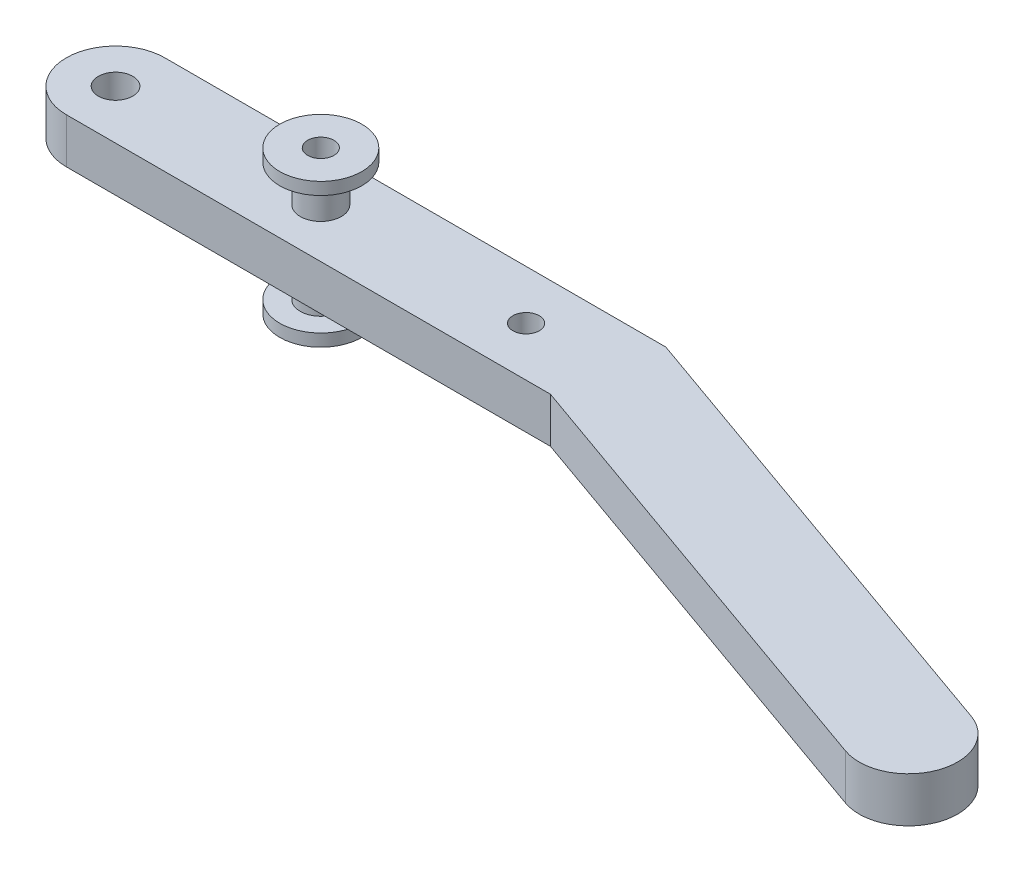
ISO-10303-21;
HEADER;
FILE_DESCRIPTION(('STEP AP214'),'2;1');
FILE_NAME('part.step','',(''),(''),'','','');
FILE_SCHEMA(('AUTOMOTIVE_DESIGN { 1 0 10303 214 1 1 1 1 }'));
ENDSEC;
DATA;
#1=APPLICATION_CONTEXT('core data for automotive mechanical design processes');
#2=APPLICATION_PROTOCOL_DEFINITION('international standard','automotive_design',2000,#1);
#3=PRODUCT_CONTEXT('',#1,'mechanical');
#4=PRODUCT('Part','Part','',(#3));
#5=PRODUCT_RELATED_PRODUCT_CATEGORY('part','',(#4));
#6=PRODUCT_DEFINITION_FORMATION('','',#4);
#7=PRODUCT_DEFINITION_CONTEXT('part definition',#1,'design');
#8=PRODUCT_DEFINITION('design','',#6,#7);
#9=PRODUCT_DEFINITION_SHAPE('','',#8);
#10=(LENGTH_UNIT() NAMED_UNIT(*) SI_UNIT(.MILLI.,.METRE.));
#11=(NAMED_UNIT(*) PLANE_ANGLE_UNIT() SI_UNIT($,.RADIAN.));
#12=(NAMED_UNIT(*) SI_UNIT($,.STERADIAN.) SOLID_ANGLE_UNIT());
#13=UNCERTAINTY_MEASURE_WITH_UNIT(LENGTH_MEASURE(1.E-05),#10,'distance_accuracy_value','');
#14=(GEOMETRIC_REPRESENTATION_CONTEXT(3) GLOBAL_UNCERTAINTY_ASSIGNED_CONTEXT((#13)) GLOBAL_UNIT_ASSIGNED_CONTEXT((#10,
#11,#12)) REPRESENTATION_CONTEXT('',''));
#15=CARTESIAN_POINT('',(0.,0.,0.));
#16=DIRECTION('',(0.,0.,1.));
#17=DIRECTION('',(1.,0.,0.));
#18=AXIS2_PLACEMENT_3D('',#15,#16,#17);
#19=CARTESIAN_POINT('',(25.,0.,0.));
#20=DIRECTION('',(0.,-1.,0.));
#21=DIRECTION('',(0.,0.,1.));
#22=AXIS2_PLACEMENT_3D('',#19,#20,#21);
#23=PLANE('',#22);
#24=CARTESIAN_POINT('',(25.,0.,0.));
#25=DIRECTION('',(0.,1.,0.));
#26=DIRECTION('',(0.,0.,1.));
#27=AXIS2_PLACEMENT_3D('',#24,#25,#26);
#28=CIRCLE('',#27,2.5);
#29=CARTESIAN_POINT('',(25.,0.,2.5));
#30=VERTEX_POINT('',#29);
#31=EDGE_CURVE('E47',#30,#30,#28,.T.);
#32=ORIENTED_EDGE('',*,*,#31,.T.);
#33=EDGE_LOOP('',(#32));
#34=FACE_BOUND('',#33,.T.);
#35=CARTESIAN_POINT('',(25.,0.,0.));
#36=DIRECTION('',(0.,1.,0.));
#37=DIRECTION('',(0.,0.,1.));
#38=AXIS2_PLACEMENT_3D('',#35,#36,#37);
#39=CIRCLE('',#38,1.6);
#40=CARTESIAN_POINT('',(25.,0.,1.6));
#41=VERTEX_POINT('',#40);
#42=EDGE_CURVE('E54',#41,#41,#39,.T.);
#43=ORIENTED_EDGE('',*,*,#42,.F.);
#44=EDGE_LOOP('',(#43));
#45=FACE_BOUND('',#44,.T.);
#46=ADVANCED_FACE('F43',(#34,#45),#23,.F.);
#47=CARTESIAN_POINT('',(25.,-4.5,0.));
#48=DIRECTION('',(0.,1.,0.));
#49=DIRECTION('',(0.,0.,-1.));
#50=AXIS2_PLACEMENT_3D('',#47,#48,#49);
#51=CYLINDRICAL_SURFACE('',#50,2.5);
#52=CARTESIAN_POINT('',(25.,-4.5,0.));
#53=DIRECTION('',(0.,1.,0.));
#54=DIRECTION('',(0.,0.,1.));
#55=AXIS2_PLACEMENT_3D('',#52,#53,#54);
#56=CIRCLE('',#55,2.5);
#57=CARTESIAN_POINT('',(25.,-4.5,2.5));
#58=VERTEX_POINT('',#57);
#59=EDGE_CURVE('E11',#58,#58,#56,.T.);
#60=ORIENTED_EDGE('',*,*,#59,.T.);
#61=EDGE_LOOP('',(#60));
#62=FACE_BOUND('',#61,.T.);
#63=ORIENTED_EDGE('',*,*,#31,.F.);
#64=EDGE_LOOP('',(#63));
#65=FACE_BOUND('',#64,.T.);
#66=ADVANCED_FACE('F45',(#62,#65),#51,.T.);
#67=CARTESIAN_POINT('',(25.,-4.5,0.));
#68=DIRECTION('',(0.,1.,0.));
#69=DIRECTION('',(0.,0.,-1.));
#70=AXIS2_PLACEMENT_3D('',#67,#68,#69);
#71=CYLINDRICAL_SURFACE('',#70,1.6);
#72=ORIENTED_EDGE('',*,*,#42,.T.);
#73=EDGE_LOOP('',(#72));
#74=FACE_BOUND('',#73,.T.);
#75=CARTESIAN_POINT('',(25.,-6.,0.));
#76=DIRECTION('',(0.,1.,0.));
#77=DIRECTION('',(0.,0.,1.));
#78=AXIS2_PLACEMENT_3D('',#75,#76,#77);
#79=CIRCLE('',#78,1.6);
#80=CARTESIAN_POINT('',(25.,-6.,1.6));
#81=VERTEX_POINT('',#80);
#82=EDGE_CURVE('E62',#81,#81,#79,.T.);
#83=ORIENTED_EDGE('',*,*,#82,.F.);
#84=EDGE_LOOP('',(#83));
#85=FACE_BOUND('',#84,.T.);
#86=ADVANCED_FACE('F70',(#74,#85),#71,.F.);
#87=CARTESIAN_POINT('',(25.,-6.,0.));
#88=DIRECTION('',(0.,-1.,0.));
#89=DIRECTION('',(0.,0.,1.));
#90=AXIS2_PLACEMENT_3D('',#87,#88,#89);
#91=PLANE('',#90);
#92=CARTESIAN_POINT('',(25.,-6.,0.));
#93=DIRECTION('',(0.,1.,0.));
#94=DIRECTION('',(0.,0.,1.));
#95=AXIS2_PLACEMENT_3D('',#92,#93,#94);
#96=CIRCLE('',#95,5.);
#97=CARTESIAN_POINT('',(25.,-6.,5.));
#98=VERTEX_POINT('',#97);
#99=EDGE_CURVE('E58',#98,#98,#96,.T.);
#100=ORIENTED_EDGE('',*,*,#99,.F.);
#101=EDGE_LOOP('',(#100));
#102=FACE_BOUND('',#101,.T.);
#103=ORIENTED_EDGE('',*,*,#82,.T.);
#104=EDGE_LOOP('',(#103));
#105=FACE_BOUND('',#104,.T.);
#106=ADVANCED_FACE('F68',(#102,#105),#91,.T.);
#107=CARTESIAN_POINT('',(25.,-4.5,0.));
#108=DIRECTION('',(0.,-1.,0.));
#109=DIRECTION('',(0.,0.,1.));
#110=AXIS2_PLACEMENT_3D('',#107,#108,#109);
#111=PLANE('',#110);
#112=ORIENTED_EDGE('',*,*,#59,.F.);
#113=EDGE_LOOP('',(#112));
#114=FACE_BOUND('',#113,.T.);
#115=CARTESIAN_POINT('',(25.,-4.5,0.));
#116=DIRECTION('',(0.,1.,0.));
#117=DIRECTION('',(0.,0.,1.));
#118=AXIS2_PLACEMENT_3D('',#115,#116,#117);
#119=CIRCLE('',#118,5.);
#120=CARTESIAN_POINT('',(25.,-4.5,5.));
#121=VERTEX_POINT('',#120);
#122=EDGE_CURVE('E59',#121,#121,#119,.T.);
#123=ORIENTED_EDGE('',*,*,#122,.T.);
#124=EDGE_LOOP('',(#123));
#125=FACE_BOUND('',#124,.T.);
#126=ADVANCED_FACE('F78',(#114,#125),#111,.F.);
#127=CARTESIAN_POINT('',(25.,-6.,0.));
#128=DIRECTION('',(0.,1.,0.));
#129=DIRECTION('',(0.,0.,-1.));
#130=AXIS2_PLACEMENT_3D('',#127,#128,#129);
#131=CYLINDRICAL_SURFACE('',#130,5.);
#132=ORIENTED_EDGE('',*,*,#99,.T.);
#133=EDGE_LOOP('',(#132));
#134=FACE_BOUND('',#133,.T.);
#135=ORIENTED_EDGE('',*,*,#122,.F.);
#136=EDGE_LOOP('',(#135));
#137=FACE_BOUND('',#136,.T.);
#138=ADVANCED_FACE('F114',(#134,#137),#131,.T.);
#139=CLOSED_SHELL('',(#46,#66,#86,#106,#126,#138));
#140=MANIFOLD_SOLID_BREP('B2',#139);
#141=CARTESIAN_POINT('',(25.,5.5,0.));
#142=DIRECTION('',(0.,1.,0.));
#143=DIRECTION('',(0.,0.,1.));
#144=AXIS2_PLACEMENT_3D('',#141,#142,#143);
#145=PLANE('',#144);
#146=CARTESIAN_POINT('',(25.,5.5,0.));
#147=DIRECTION('',(0.,1.,0.));
#148=DIRECTION('',(0.,0.,1.));
#149=AXIS2_PLACEMENT_3D('',#146,#147,#148);
#150=CIRCLE('',#149,2.5);
#151=CARTESIAN_POINT('',(25.,5.5,2.5));
#152=VERTEX_POINT('',#151);
#153=EDGE_CURVE('E150',#152,#152,#150,.T.);
#154=ORIENTED_EDGE('',*,*,#153,.F.);
#155=EDGE_LOOP('',(#154));
#156=FACE_BOUND('',#155,.T.);
#157=CARTESIAN_POINT('',(25.,5.5,0.));
#158=DIRECTION('',(0.,1.,0.));
#159=DIRECTION('',(0.,0.,1.));
#160=AXIS2_PLACEMENT_3D('',#157,#158,#159);
#161=CIRCLE('',#160,1.6);
#162=CARTESIAN_POINT('',(25.,5.5,1.6));
#163=VERTEX_POINT('',#162);
#164=EDGE_CURVE('E157',#163,#163,#161,.T.);
#165=ORIENTED_EDGE('',*,*,#164,.T.);
#166=EDGE_LOOP('',(#165));
#167=FACE_BOUND('',#166,.T.);
#168=ADVANCED_FACE('F146',(#156,#167),#145,.F.);
#169=CARTESIAN_POINT('',(25.,10.,0.));
#170=DIRECTION('',(0.,-1.,0.));
#171=DIRECTION('',(0.,0.,-1.));
#172=AXIS2_PLACEMENT_3D('',#169,#170,#171);
#173=CYLINDRICAL_SURFACE('',#172,2.5);
#174=CARTESIAN_POINT('',(25.,10.,0.));
#175=DIRECTION('',(0.,1.,0.));
#176=DIRECTION('',(0.,0.,1.));
#177=AXIS2_PLACEMENT_3D('',#174,#175,#176);
#178=CIRCLE('',#177,2.5);
#179=CARTESIAN_POINT('',(25.,10.,2.5));
#180=VERTEX_POINT('',#179);
#181=EDGE_CURVE('E42',#180,#180,#178,.T.);
#182=ORIENTED_EDGE('',*,*,#181,.F.);
#183=EDGE_LOOP('',(#182));
#184=FACE_BOUND('',#183,.T.);
#185=ORIENTED_EDGE('',*,*,#153,.T.);
#186=EDGE_LOOP('',(#185));
#187=FACE_BOUND('',#186,.T.);
#188=ADVANCED_FACE('F148',(#184,#187),#173,.T.);
#189=CARTESIAN_POINT('',(25.,10.,0.));
#190=DIRECTION('',(0.,-1.,0.));
#191=DIRECTION('',(0.,0.,-1.));
#192=AXIS2_PLACEMENT_3D('',#189,#190,#191);
#193=CYLINDRICAL_SURFACE('',#192,1.6);
#194=ORIENTED_EDGE('',*,*,#164,.F.);
#195=EDGE_LOOP('',(#194));
#196=FACE_BOUND('',#195,.T.);
#197=CARTESIAN_POINT('',(25.,11.5,0.));
#198=DIRECTION('',(0.,1.,0.));
#199=DIRECTION('',(0.,0.,1.));
#200=AXIS2_PLACEMENT_3D('',#197,#198,#199);
#201=CIRCLE('',#200,1.6);
#202=CARTESIAN_POINT('',(25.,11.5,1.6));
#203=VERTEX_POINT('',#202);
#204=EDGE_CURVE('E165',#203,#203,#201,.T.);
#205=ORIENTED_EDGE('',*,*,#204,.T.);
#206=EDGE_LOOP('',(#205));
#207=FACE_BOUND('',#206,.T.);
#208=ADVANCED_FACE('F171',(#196,#207),#193,.F.);
#209=CARTESIAN_POINT('',(25.,11.5,0.));
#210=DIRECTION('',(0.,1.,0.));
#211=DIRECTION('',(0.,0.,1.));
#212=AXIS2_PLACEMENT_3D('',#209,#210,#211);
#213=PLANE('',#212);
#214=CARTESIAN_POINT('',(25.,11.5,0.));
#215=DIRECTION('',(0.,1.,0.));
#216=DIRECTION('',(0.,0.,1.));
#217=AXIS2_PLACEMENT_3D('',#214,#215,#216);
#218=CIRCLE('',#217,5.);
#219=CARTESIAN_POINT('',(25.,11.5,5.));
#220=VERTEX_POINT('',#219);
#221=EDGE_CURVE('E161',#220,#220,#218,.T.);
#222=ORIENTED_EDGE('',*,*,#221,.T.);
#223=EDGE_LOOP('',(#222));
#224=FACE_BOUND('',#223,.T.);
#225=ORIENTED_EDGE('',*,*,#204,.F.);
#226=EDGE_LOOP('',(#225));
#227=FACE_BOUND('',#226,.T.);
#228=ADVANCED_FACE('F173',(#224,#227),#213,.T.);
#229=CARTESIAN_POINT('',(25.,10.,0.));
#230=DIRECTION('',(0.,1.,0.));
#231=DIRECTION('',(0.,0.,1.));
#232=AXIS2_PLACEMENT_3D('',#229,#230,#231);
#233=PLANE('',#232);
#234=ORIENTED_EDGE('',*,*,#181,.T.);
#235=EDGE_LOOP('',(#234));
#236=FACE_BOUND('',#235,.T.);
#237=CARTESIAN_POINT('',(25.,10.,0.));
#238=DIRECTION('',(0.,1.,0.));
#239=DIRECTION('',(0.,0.,1.));
#240=AXIS2_PLACEMENT_3D('',#237,#238,#239);
#241=CIRCLE('',#240,5.);
#242=CARTESIAN_POINT('',(25.,10.,5.));
#243=VERTEX_POINT('',#242);
#244=EDGE_CURVE('E162',#243,#243,#241,.T.);
#245=ORIENTED_EDGE('',*,*,#244,.F.);
#246=EDGE_LOOP('',(#245));
#247=FACE_BOUND('',#246,.T.);
#248=ADVANCED_FACE('F175',(#236,#247),#233,.F.);
#249=CARTESIAN_POINT('',(25.,11.5,0.));
#250=DIRECTION('',(0.,-1.,0.));
#251=DIRECTION('',(0.,0.,-1.));
#252=AXIS2_PLACEMENT_3D('',#249,#250,#251);
#253=CYLINDRICAL_SURFACE('',#252,5.);
#254=ORIENTED_EDGE('',*,*,#221,.F.);
#255=EDGE_LOOP('',(#254));
#256=FACE_BOUND('',#255,.T.);
#257=ORIENTED_EDGE('',*,*,#244,.T.);
#258=EDGE_LOOP('',(#257));
#259=FACE_BOUND('',#258,.T.);
#260=ADVANCED_FACE('F182',(#256,#259),#253,.T.);
#261=CLOSED_SHELL('',(#168,#188,#208,#228,#248,#260));
#262=MANIFOLD_SOLID_BREP('B6',#261);
#263=CARTESIAN_POINT('',(0.,5.5,0.));
#264=DIRECTION('',(0.,1.,0.));
#265=DIRECTION('',(0.,0.,1.));
#266=AXIS2_PLACEMENT_3D('',#263,#264,#265);
#267=PLANE('',#266);
#268=CARTESIAN_POINT('',(0.,5.5,0.));
#269=DIRECTION('',(0.,1.,0.));
#270=DIRECTION('',(0.,0.,1.));
#271=AXIS2_PLACEMENT_3D('',#268,#269,#270);
#272=CIRCLE('',#271,2.1);
#273=CARTESIAN_POINT('',(0.,5.5,2.1));
#274=VERTEX_POINT('',#273);
#275=EDGE_CURVE('E391',#274,#274,#272,.T.);
#276=ORIENTED_EDGE('',*,*,#275,.F.);
#277=EDGE_LOOP('',(#276));
#278=FACE_BOUND('',#277,.T.);
#279=CARTESIAN_POINT('',(0.,5.5,0.));
#280=DIRECTION('',(0.,1.,0.));
#281=DIRECTION('',(0.,0.,1.));
#282=AXIS2_PLACEMENT_3D('',#279,#280,#281);
#283=CIRCLE('',#282,6.);
#284=CARTESIAN_POINT('',(0.,5.5,-6.));
#285=VERTEX_POINT('',#284);
#286=CARTESIAN_POINT('',(0.,5.5,6.));
#287=VERTEX_POINT('',#286);
#288=EDGE_CURVE('E336',#285,#287,#283,.T.);
#289=ORIENTED_EDGE('',*,*,#288,.T.);
#290=DIRECTION('',(1.,0.,0.));
#291=VECTOR('',#290,1.);
#292=CARTESIAN_POINT('',(0.,5.5,6.));
#293=LINE('',#292,#291);
#294=CARTESIAN_POINT('',(58.9705627484771,5.5,6.));
#295=VERTEX_POINT('',#294);
#296=EDGE_CURVE('E294',#287,#295,#293,.T.);
#297=ORIENTED_EDGE('',*,*,#296,.T.);
#298=DIRECTION('',(0.942809041582063,0.,0.333333333333333));
#299=VECTOR('',#298,1.);
#300=CARTESIAN_POINT('',(58.9705627484771,5.5,6.));
#301=LINE('',#300,#299);
#302=CARTESIAN_POINT('',(114.568542494924,5.5,25.6568542494924));
#303=VERTEX_POINT('',#302);
#304=EDGE_CURVE('E307',#295,#303,#301,.T.);
#305=ORIENTED_EDGE('',*,*,#304,.T.);
#306=CARTESIAN_POINT('',(116.568542494924,5.5,20.));
#307=DIRECTION('',(0.,1.,0.));
#308=DIRECTION('',(0.,0.,1.));
#309=AXIS2_PLACEMENT_3D('',#306,#307,#308);
#310=CIRCLE('',#309,6.);
#311=CARTESIAN_POINT('',(118.568542494924,5.5,14.3431457505076));
#312=VERTEX_POINT('',#311);
#313=EDGE_CURVE('E301',#303,#312,#310,.T.);
#314=ORIENTED_EDGE('',*,*,#313,.T.);
#315=DIRECTION('',(-0.942809041582063,0.,-0.333333333333333));
#316=VECTOR('',#315,1.);
#317=CARTESIAN_POINT('',(61.0294372515229,5.5,-6.));
#318=LINE('',#317,#316);
#319=CARTESIAN_POINT('',(61.0294372515229,5.5,-6.));
#320=VERTEX_POINT('',#319);
#321=EDGE_CURVE('E305',#312,#320,#318,.T.);
#322=ORIENTED_EDGE('',*,*,#321,.T.);
#323=DIRECTION('',(-1.,0.,0.));
#324=VECTOR('',#323,1.);
#325=CARTESIAN_POINT('',(0.,5.5,-6.));
#326=LINE('',#325,#324);
#327=EDGE_CURVE('E257',#320,#285,#326,.T.);
#328=ORIENTED_EDGE('',*,*,#327,.T.);
#329=EDGE_LOOP('',(#289,#297,#305,#314,#322,#328));
#330=FACE_BOUND('',#329,.T.);
#331=CARTESIAN_POINT('',(50.,5.5,0.));
#332=DIRECTION('',(0.,1.,0.));
#333=DIRECTION('',(0.,0.,1.));
#334=AXIS2_PLACEMENT_3D('',#331,#332,#333);
#335=CIRCLE('',#334,1.6);
#336=CARTESIAN_POINT('',(50.,5.5,1.6));
#337=VERTEX_POINT('',#336);
#338=EDGE_CURVE('E329',#337,#337,#335,.T.);
#339=ORIENTED_EDGE('',*,*,#338,.F.);
#340=EDGE_LOOP('',(#339));
#341=FACE_BOUND('',#340,.T.);
#342=CARTESIAN_POINT('',(25.,5.5,0.));
#343=DIRECTION('',(0.,1.,0.));
#344=DIRECTION('',(0.,0.,1.));
#345=AXIS2_PLACEMENT_3D('',#342,#343,#344);
#346=CIRCLE('',#345,1.6);
#347=CARTESIAN_POINT('',(25.,5.5,1.6));
#348=VERTEX_POINT('',#347);
#349=EDGE_CURVE('E382',#348,#348,#346,.T.);
#350=ORIENTED_EDGE('',*,*,#349,.F.);
#351=EDGE_LOOP('',(#350));
#352=FACE_BOUND('',#351,.T.);
#353=ADVANCED_FACE('F240',(#278,#330,#341,#352),#267,.T.);
#354=CARTESIAN_POINT('',(0.,0.,0.));
#355=DIRECTION('',(0.,1.,0.));
#356=DIRECTION('',(0.,0.,1.));
#357=AXIS2_PLACEMENT_3D('',#354,#355,#356);
#358=PLANE('',#357);
#359=CARTESIAN_POINT('',(0.,0.,0.));
#360=DIRECTION('',(0.,1.,0.));
#361=DIRECTION('',(0.,0.,1.));
#362=AXIS2_PLACEMENT_3D('',#359,#360,#361);
#363=CIRCLE('',#362,6.);
#364=CARTESIAN_POINT('',(0.,0.,-6.));
#365=VERTEX_POINT('',#364);
#366=CARTESIAN_POINT('',(0.,0.,6.));
#367=VERTEX_POINT('',#366);
#368=EDGE_CURVE('E325',#365,#367,#363,.T.);
#369=ORIENTED_EDGE('',*,*,#368,.F.);
#370=DIRECTION('',(-1.,0.,0.));
#371=VECTOR('',#370,1.);
#372=CARTESIAN_POINT('',(0.,0.,-6.));
#373=LINE('',#372,#371);
#374=CARTESIAN_POINT('',(61.0294372515229,0.,-6.));
#375=VERTEX_POINT('',#374);
#376=EDGE_CURVE('E286',#375,#365,#373,.T.);
#377=ORIENTED_EDGE('',*,*,#376,.F.);
#378=DIRECTION('',(-0.942809041582063,0.,-0.333333333333333));
#379=VECTOR('',#378,1.);
#380=CARTESIAN_POINT('',(61.0294372515229,0.,-6.));
#381=LINE('',#380,#379);
#382=CARTESIAN_POINT('',(118.568542494924,0.,14.3431457505076));
#383=VERTEX_POINT('',#382);
#384=EDGE_CURVE('E280',#383,#375,#381,.T.);
#385=ORIENTED_EDGE('',*,*,#384,.F.);
#386=CARTESIAN_POINT('',(116.568542494924,0.,20.));
#387=DIRECTION('',(0.,1.,0.));
#388=DIRECTION('',(0.,0.,1.));
#389=AXIS2_PLACEMENT_3D('',#386,#387,#388);
#390=CIRCLE('',#389,6.);
#391=CARTESIAN_POINT('',(114.568542494924,0.,25.6568542494924));
#392=VERTEX_POINT('',#391);
#393=EDGE_CURVE('E315',#392,#383,#390,.T.);
#394=ORIENTED_EDGE('',*,*,#393,.F.);
#395=DIRECTION('',(0.942809041582063,0.,0.333333333333333));
#396=VECTOR('',#395,1.);
#397=CARTESIAN_POINT('',(58.9705627484771,0.,6.));
#398=LINE('',#397,#396);
#399=CARTESIAN_POINT('',(58.9705627484771,0.,6.));
#400=VERTEX_POINT('',#399);
#401=EDGE_CURVE('E331',#400,#392,#398,.T.);
#402=ORIENTED_EDGE('',*,*,#401,.F.);
#403=DIRECTION('',(1.,0.,0.));
#404=VECTOR('',#403,1.);
#405=CARTESIAN_POINT('',(0.,0.,6.));
#406=LINE('',#405,#404);
#407=EDGE_CURVE('E328',#367,#400,#406,.T.);
#408=ORIENTED_EDGE('',*,*,#407,.F.);
#409=EDGE_LOOP('',(#369,#377,#385,#394,#402,#408));
#410=FACE_BOUND('',#409,.T.);
#411=CARTESIAN_POINT('',(50.,0.,0.));
#412=DIRECTION('',(0.,1.,0.));
#413=DIRECTION('',(0.,0.,1.));
#414=AXIS2_PLACEMENT_3D('',#411,#412,#413);
#415=CIRCLE('',#414,1.6);
#416=CARTESIAN_POINT('',(50.,0.,1.6));
#417=VERTEX_POINT('',#416);
#418=EDGE_CURVE('E394',#417,#417,#415,.T.);
#419=ORIENTED_EDGE('',*,*,#418,.T.);
#420=EDGE_LOOP('',(#419));
#421=FACE_BOUND('',#420,.T.);
#422=CARTESIAN_POINT('',(0.,0.,0.));
#423=DIRECTION('',(0.,1.,0.));
#424=DIRECTION('',(0.,0.,1.));
#425=AXIS2_PLACEMENT_3D('',#422,#423,#424);
#426=CIRCLE('',#425,2.1);
#427=CARTESIAN_POINT('',(0.,0.,2.1));
#428=VERTEX_POINT('',#427);
#429=EDGE_CURVE('E388',#428,#428,#426,.T.);
#430=ORIENTED_EDGE('',*,*,#429,.T.);
#431=EDGE_LOOP('',(#430));
#432=FACE_BOUND('',#431,.T.);
#433=CARTESIAN_POINT('',(25.,0.,0.));
#434=DIRECTION('',(0.,1.,0.));
#435=DIRECTION('',(0.,0.,1.));
#436=AXIS2_PLACEMENT_3D('',#433,#434,#435);
#437=CIRCLE('',#436,1.6);
#438=CARTESIAN_POINT('',(25.,0.,1.6));
#439=VERTEX_POINT('',#438);
#440=EDGE_CURVE('E385',#439,#439,#437,.T.);
#441=ORIENTED_EDGE('',*,*,#440,.T.);
#442=EDGE_LOOP('',(#441));
#443=FACE_BOUND('',#442,.T.);
#444=ADVANCED_FACE('F345',(#410,#421,#432,#443),#358,.F.);
#445=CARTESIAN_POINT('',(0.,5.5,0.));
#446=DIRECTION('',(0.,-1.,0.));
#447=DIRECTION('',(0.,0.,-1.));
#448=AXIS2_PLACEMENT_3D('',#445,#446,#447);
#449=CYLINDRICAL_SURFACE('',#448,6.);
#450=ORIENTED_EDGE('',*,*,#368,.T.);
#451=DIRECTION('',(0.,-1.,0.));
#452=VECTOR('',#451,1.);
#453=CARTESIAN_POINT('',(0.,5.5,6.));
#454=LINE('',#453,#452);
#455=EDGE_CURVE('E144',#287,#367,#454,.T.);
#456=ORIENTED_EDGE('',*,*,#455,.F.);
#457=ORIENTED_EDGE('',*,*,#288,.F.);
#458=DIRECTION('',(0.,-1.,0.));
#459=VECTOR('',#458,1.);
#460=CARTESIAN_POINT('',(0.,5.5,-6.));
#461=LINE('',#460,#459);
#462=EDGE_CURVE('E321',#285,#365,#461,.T.);
#463=ORIENTED_EDGE('',*,*,#462,.T.);
#464=EDGE_LOOP('',(#450,#456,#457,#463));
#465=FACE_BOUND('',#464,.T.);
#466=ADVANCED_FACE('F242',(#465),#449,.T.);
#467=CARTESIAN_POINT('',(0.,5.5,6.));
#468=DIRECTION('',(0.,0.,-1.));
#469=DIRECTION('',(-1.,0.,0.));
#470=AXIS2_PLACEMENT_3D('',#467,#468,#469);
#471=PLANE('',#470);
#472=ORIENTED_EDGE('',*,*,#407,.T.);
#473=DIRECTION('',(0.,-1.,0.));
#474=VECTOR('',#473,1.);
#475=CARTESIAN_POINT('',(58.9705627484771,5.5,6.));
#476=LINE('',#475,#474);
#477=EDGE_CURVE('E249',#295,#400,#476,.T.);
#478=ORIENTED_EDGE('',*,*,#477,.F.);
#479=ORIENTED_EDGE('',*,*,#296,.F.);
#480=ORIENTED_EDGE('',*,*,#455,.T.);
#481=EDGE_LOOP('',(#472,#478,#479,#480));
#482=FACE_BOUND('',#481,.T.);
#483=ADVANCED_FACE('F444',(#482),#471,.F.);
#484=CARTESIAN_POINT('',(58.9705627484771,5.5,6.));
#485=DIRECTION('',(0.333333333333334,0.,-0.942809041582063));
#486=DIRECTION('',(-0.942809041582063,0.,-0.333333333333334));
#487=AXIS2_PLACEMENT_3D('',#484,#485,#486);
#488=PLANE('',#487);
#489=ORIENTED_EDGE('',*,*,#401,.T.);
#490=DIRECTION('',(0.,-1.,0.));
#491=VECTOR('',#490,1.);
#492=CARTESIAN_POINT('',(114.568542494924,5.5,25.6568542494924));
#493=LINE('',#492,#491);
#494=EDGE_CURVE('E316',#303,#392,#493,.T.);
#495=ORIENTED_EDGE('',*,*,#494,.F.);
#496=ORIENTED_EDGE('',*,*,#304,.F.);
#497=ORIENTED_EDGE('',*,*,#477,.T.);
#498=EDGE_LOOP('',(#489,#495,#496,#497));
#499=FACE_BOUND('',#498,.T.);
#500=ADVANCED_FACE('F342',(#499),#488,.F.);
#501=CARTESIAN_POINT('',(116.568542494924,5.5,20.));
#502=DIRECTION('',(0.,-1.,0.));
#503=DIRECTION('',(0.,0.,-1.));
#504=AXIS2_PLACEMENT_3D('',#501,#502,#503);
#505=CYLINDRICAL_SURFACE('',#504,6.);
#506=ORIENTED_EDGE('',*,*,#393,.T.);
#507=DIRECTION('',(0.,-1.,0.));
#508=VECTOR('',#507,1.);
#509=CARTESIAN_POINT('',(118.568542494924,5.5,14.3431457505076));
#510=LINE('',#509,#508);
#511=EDGE_CURVE('E312',#312,#383,#510,.T.);
#512=ORIENTED_EDGE('',*,*,#511,.F.);
#513=ORIENTED_EDGE('',*,*,#313,.F.);
#514=ORIENTED_EDGE('',*,*,#494,.T.);
#515=EDGE_LOOP('',(#506,#512,#513,#514));
#516=FACE_BOUND('',#515,.T.);
#517=ADVANCED_FACE('F313',(#516),#505,.T.);
#518=CARTESIAN_POINT('',(61.0294372515229,5.5,-6.));
#519=DIRECTION('',(-0.333333333333333,0.,0.942809041582063));
#520=DIRECTION('',(0.942809041582063,0.,0.333333333333333));
#521=AXIS2_PLACEMENT_3D('',#518,#519,#520);
#522=PLANE('',#521);
#523=ORIENTED_EDGE('',*,*,#384,.T.);
#524=DIRECTION('',(0.,-1.,0.));
#525=VECTOR('',#524,1.);
#526=CARTESIAN_POINT('',(61.0294372515229,5.5,-6.));
#527=LINE('',#526,#525);
#528=EDGE_CURVE('E317',#320,#375,#527,.T.);
#529=ORIENTED_EDGE('',*,*,#528,.F.);
#530=ORIENTED_EDGE('',*,*,#321,.F.);
#531=ORIENTED_EDGE('',*,*,#511,.T.);
#532=EDGE_LOOP('',(#523,#529,#530,#531));
#533=FACE_BOUND('',#532,.T.);
#534=ADVANCED_FACE('F319',(#533),#522,.F.);
#535=CARTESIAN_POINT('',(0.,5.5,-6.));
#536=DIRECTION('',(0.,0.,1.));
#537=DIRECTION('',(1.,0.,0.));
#538=AXIS2_PLACEMENT_3D('',#535,#536,#537);
#539=PLANE('',#538);
#540=ORIENTED_EDGE('',*,*,#376,.T.);
#541=ORIENTED_EDGE('',*,*,#462,.F.);
#542=ORIENTED_EDGE('',*,*,#327,.F.);
#543=ORIENTED_EDGE('',*,*,#528,.T.);
#544=EDGE_LOOP('',(#540,#541,#542,#543));
#545=FACE_BOUND('',#544,.T.);
#546=ADVANCED_FACE('F350',(#545),#539,.F.);
#547=CARTESIAN_POINT('',(50.,5.5,0.));
#548=DIRECTION('',(0.,-1.,0.));
#549=DIRECTION('',(0.,0.,-1.));
#550=AXIS2_PLACEMENT_3D('',#547,#548,#549);
#551=CYLINDRICAL_SURFACE('',#550,1.6);
#552=ORIENTED_EDGE('',*,*,#338,.T.);
#553=EDGE_LOOP('',(#552));
#554=FACE_BOUND('',#553,.T.);
#555=ORIENTED_EDGE('',*,*,#418,.F.);
#556=EDGE_LOOP('',(#555));
#557=FACE_BOUND('',#556,.T.);
#558=ADVANCED_FACE('F352',(#554,#557),#551,.F.);
#559=CARTESIAN_POINT('',(0.,5.5,0.));
#560=DIRECTION('',(0.,-1.,0.));
#561=DIRECTION('',(0.,0.,-1.));
#562=AXIS2_PLACEMENT_3D('',#559,#560,#561);
#563=CYLINDRICAL_SURFACE('',#562,2.1);
#564=ORIENTED_EDGE('',*,*,#275,.T.);
#565=EDGE_LOOP('',(#564));
#566=FACE_BOUND('',#565,.T.);
#567=ORIENTED_EDGE('',*,*,#429,.F.);
#568=EDGE_LOOP('',(#567));
#569=FACE_BOUND('',#568,.T.);
#570=ADVANCED_FACE('F358',(#566,#569),#563,.F.);
#571=CARTESIAN_POINT('',(25.,5.5,0.));
#572=DIRECTION('',(0.,-1.,0.));
#573=DIRECTION('',(0.,0.,-1.));
#574=AXIS2_PLACEMENT_3D('',#571,#572,#573);
#575=CYLINDRICAL_SURFACE('',#574,1.6);
#576=ORIENTED_EDGE('',*,*,#349,.T.);
#577=EDGE_LOOP('',(#576));
#578=FACE_BOUND('',#577,.T.);
#579=ORIENTED_EDGE('',*,*,#440,.F.);
#580=EDGE_LOOP('',(#579));
#581=FACE_BOUND('',#580,.T.);
#582=ADVANCED_FACE('F373',(#578,#581),#575,.F.);
#583=CLOSED_SHELL('',(#353,#444,#466,#483,#500,#517,#534,#546,#558,#570,#582));
#584=MANIFOLD_SOLID_BREP('B37',#583);
#585=ADVANCED_BREP_SHAPE_REPRESENTATION('',(#18,#140,#262,#584),#14);
#586=SHAPE_DEFINITION_REPRESENTATION(#9,#585);
ENDSEC;
END-ISO-10303-21;
